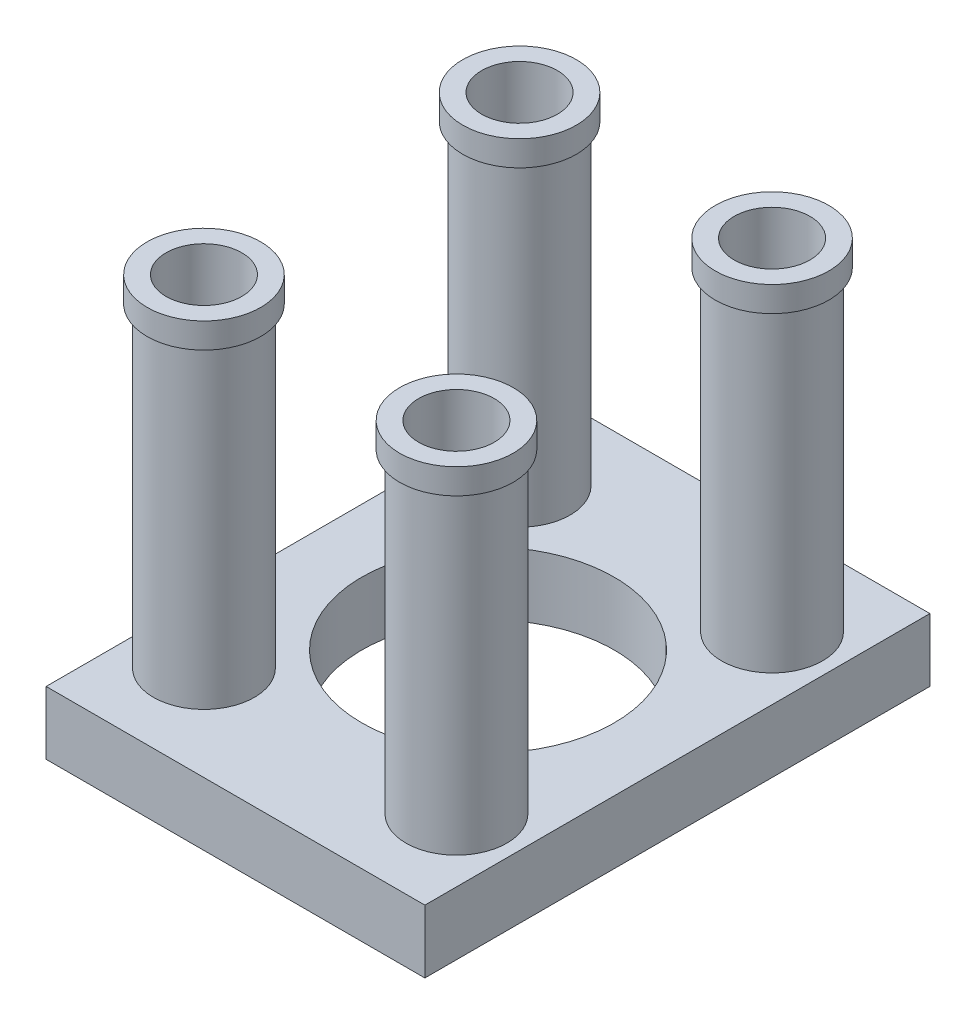
ISO-10303-21;
HEADER;
FILE_DESCRIPTION(('STEP AP214'),'2;1');
FILE_NAME('part.step','',(''),(''),'','','');
FILE_SCHEMA(('AUTOMOTIVE_DESIGN { 1 0 10303 214 1 1 1 1 }'));
ENDSEC;
DATA;
#1=APPLICATION_CONTEXT('core data for automotive mechanical design processes');
#2=APPLICATION_PROTOCOL_DEFINITION('international standard','automotive_design',2000,#1);
#3=PRODUCT_CONTEXT('',#1,'mechanical');
#4=PRODUCT('Part','Part','',(#3));
#5=PRODUCT_RELATED_PRODUCT_CATEGORY('part','',(#4));
#6=PRODUCT_DEFINITION_FORMATION('','',#4);
#7=PRODUCT_DEFINITION_CONTEXT('part definition',#1,'design');
#8=PRODUCT_DEFINITION('design','',#6,#7);
#9=PRODUCT_DEFINITION_SHAPE('','',#8);
#10=(LENGTH_UNIT() NAMED_UNIT(*) SI_UNIT(.MILLI.,.METRE.));
#11=(NAMED_UNIT(*) PLANE_ANGLE_UNIT() SI_UNIT($,.RADIAN.));
#12=(NAMED_UNIT(*) SI_UNIT($,.STERADIAN.) SOLID_ANGLE_UNIT());
#13=UNCERTAINTY_MEASURE_WITH_UNIT(LENGTH_MEASURE(1.E-05),#10,'distance_accuracy_value','');
#14=(GEOMETRIC_REPRESENTATION_CONTEXT(3) GLOBAL_UNCERTAINTY_ASSIGNED_CONTEXT((#13)) GLOBAL_UNIT_ASSIGNED_CONTEXT((#10,
#11,#12)) REPRESENTATION_CONTEXT('',''));
#15=CARTESIAN_POINT('',(0.,0.,0.));
#16=DIRECTION('',(0.,0.,1.));
#17=DIRECTION('',(1.,0.,0.));
#18=AXIS2_PLACEMENT_3D('',#15,#16,#17);
#19=CARTESIAN_POINT('',(-19.05,6.35,-25.4));
#20=DIRECTION('',(1.,0.,0.));
#21=DIRECTION('',(0.,0.,-1.));
#22=AXIS2_PLACEMENT_3D('',#19,#20,#21);
#23=PLANE('',#22);
#24=DIRECTION('',(0.,0.,1.));
#25=VECTOR('',#24,1.);
#26=CARTESIAN_POINT('',(-19.05,0.,-25.4));
#27=LINE('',#26,#25);
#28=CARTESIAN_POINT('',(-19.05,0.,-25.4));
#29=VERTEX_POINT('',#28);
#30=CARTESIAN_POINT('',(-19.05,0.,25.4));
#31=VERTEX_POINT('',#30);
#32=EDGE_CURVE('E98',#29,#31,#27,.T.);
#33=ORIENTED_EDGE('',*,*,#32,.T.);
#34=DIRECTION('',(0.,-1.,0.));
#35=VECTOR('',#34,1.);
#36=CARTESIAN_POINT('',(-19.05,6.35,25.4));
#37=LINE('',#36,#35);
#38=CARTESIAN_POINT('',(-19.05,6.35,25.4));
#39=VERTEX_POINT('',#38);
#40=EDGE_CURVE('E11',#39,#31,#37,.T.);
#41=ORIENTED_EDGE('',*,*,#40,.F.);
#42=DIRECTION('',(0.,0.,1.));
#43=VECTOR('',#42,1.);
#44=CARTESIAN_POINT('',(-19.05,6.35,-25.4));
#45=LINE('',#44,#43);
#46=CARTESIAN_POINT('',(-19.05,6.35,-25.4));
#47=VERTEX_POINT('',#46);
#48=EDGE_CURVE('E86',#47,#39,#45,.T.);
#49=ORIENTED_EDGE('',*,*,#48,.F.);
#50=DIRECTION('',(0.,-1.,0.));
#51=VECTOR('',#50,1.);
#52=CARTESIAN_POINT('',(-19.05,6.35,-25.4));
#53=LINE('',#52,#51);
#54=EDGE_CURVE('E94',#47,#29,#53,.T.);
#55=ORIENTED_EDGE('',*,*,#54,.T.);
#56=EDGE_LOOP('',(#33,#41,#49,#55));
#57=FACE_BOUND('',#56,.T.);
#58=ADVANCED_FACE('F35',(#57),#23,.F.);
#59=CARTESIAN_POINT('',(-19.05,6.35,25.4));
#60=DIRECTION('',(0.,0.,-1.));
#61=DIRECTION('',(-1.,0.,0.));
#62=AXIS2_PLACEMENT_3D('',#59,#60,#61);
#63=PLANE('',#62);
#64=DIRECTION('',(1.,0.,0.));
#65=VECTOR('',#64,1.);
#66=CARTESIAN_POINT('',(-19.05,0.,25.4));
#67=LINE('',#66,#65);
#68=CARTESIAN_POINT('',(19.05,0.,25.4));
#69=VERTEX_POINT('',#68);
#70=EDGE_CURVE('E90',#31,#69,#67,.T.);
#71=ORIENTED_EDGE('',*,*,#70,.T.);
#72=DIRECTION('',(0.,-1.,0.));
#73=VECTOR('',#72,1.);
#74=CARTESIAN_POINT('',(19.05,6.35,25.4));
#75=LINE('',#74,#73);
#76=CARTESIAN_POINT('',(19.05,6.35,25.4));
#77=VERTEX_POINT('',#76);
#78=EDGE_CURVE('E43',#77,#69,#75,.T.);
#79=ORIENTED_EDGE('',*,*,#78,.F.);
#80=DIRECTION('',(1.,0.,0.));
#81=VECTOR('',#80,1.);
#82=CARTESIAN_POINT('',(-19.05,6.35,25.4));
#83=LINE('',#82,#81);
#84=EDGE_CURVE('E81',#39,#77,#83,.T.);
#85=ORIENTED_EDGE('',*,*,#84,.F.);
#86=ORIENTED_EDGE('',*,*,#40,.T.);
#87=EDGE_LOOP('',(#71,#79,#85,#86));
#88=FACE_BOUND('',#87,.T.);
#89=ADVANCED_FACE('F89',(#88),#63,.F.);
#90=CARTESIAN_POINT('',(19.05,6.35,-25.4));
#91=DIRECTION('',(-1.,0.,0.));
#92=DIRECTION('',(0.,0.,1.));
#93=AXIS2_PLACEMENT_3D('',#90,#91,#92);
#94=PLANE('',#93);
#95=DIRECTION('',(0.,0.,-1.));
#96=VECTOR('',#95,1.);
#97=CARTESIAN_POINT('',(19.05,0.,-25.4));
#98=LINE('',#97,#96);
#99=CARTESIAN_POINT('',(19.05,0.,-25.4));
#100=VERTEX_POINT('',#99);
#101=EDGE_CURVE('E68',#69,#100,#98,.T.);
#102=ORIENTED_EDGE('',*,*,#101,.T.);
#103=DIRECTION('',(0.,-1.,0.));
#104=VECTOR('',#103,1.);
#105=CARTESIAN_POINT('',(19.05,6.35,-25.4));
#106=LINE('',#105,#104);
#107=CARTESIAN_POINT('',(19.05,6.35,-25.4));
#108=VERTEX_POINT('',#107);
#109=EDGE_CURVE('E91',#108,#100,#106,.T.);
#110=ORIENTED_EDGE('',*,*,#109,.F.);
#111=DIRECTION('',(0.,0.,-1.));
#112=VECTOR('',#111,1.);
#113=CARTESIAN_POINT('',(19.05,6.35,-25.4));
#114=LINE('',#113,#112);
#115=EDGE_CURVE('E84',#77,#108,#114,.T.);
#116=ORIENTED_EDGE('',*,*,#115,.F.);
#117=ORIENTED_EDGE('',*,*,#78,.T.);
#118=EDGE_LOOP('',(#102,#110,#116,#117));
#119=FACE_BOUND('',#118,.T.);
#120=ADVANCED_FACE('F92',(#119),#94,.F.);
#121=CARTESIAN_POINT('',(-19.05,6.35,-25.4));
#122=DIRECTION('',(0.,0.,1.));
#123=DIRECTION('',(1.,0.,0.));
#124=AXIS2_PLACEMENT_3D('',#121,#122,#123);
#125=PLANE('',#124);
#126=DIRECTION('',(-1.,0.,0.));
#127=VECTOR('',#126,1.);
#128=CARTESIAN_POINT('',(-19.05,0.,-25.4));
#129=LINE('',#128,#127);
#130=EDGE_CURVE('E74',#100,#29,#129,.T.);
#131=ORIENTED_EDGE('',*,*,#130,.T.);
#132=ORIENTED_EDGE('',*,*,#54,.F.);
#133=DIRECTION('',(-1.,0.,0.));
#134=VECTOR('',#133,1.);
#135=CARTESIAN_POINT('',(-19.05,6.35,-25.4));
#136=LINE('',#135,#134);
#137=EDGE_CURVE('E51',#108,#47,#136,.T.);
#138=ORIENTED_EDGE('',*,*,#137,.F.);
#139=ORIENTED_EDGE('',*,*,#109,.T.);
#140=EDGE_LOOP('',(#131,#132,#138,#139));
#141=FACE_BOUND('',#140,.T.);
#142=ADVANCED_FACE('F106',(#141),#125,.F.);
#143=CARTESIAN_POINT('',(0.,6.35,0.));
#144=DIRECTION('',(0.,1.,0.));
#145=DIRECTION('',(0.,0.,1.));
#146=AXIS2_PLACEMENT_3D('',#143,#144,#145);
#147=PLANE('',#146);
#148=CARTESIAN_POINT('',(0.,6.35,0.));
#149=DIRECTION('',(0.,1.,0.));
#150=DIRECTION('',(0.,0.,1.));
#151=AXIS2_PLACEMENT_3D('',#148,#149,#150);
#152=CIRCLE('',#151,12.7);
#153=CARTESIAN_POINT('',(0.,6.35,12.7));
#154=VERTEX_POINT('',#153);
#155=EDGE_CURVE('E136',#154,#154,#152,.T.);
#156=ORIENTED_EDGE('',*,*,#155,.F.);
#157=EDGE_LOOP('',(#156));
#158=FACE_BOUND('',#157,.T.);
#159=CARTESIAN_POINT('',(-12.7,6.35,15.875));
#160=DIRECTION('',(0.,1.,0.));
#161=DIRECTION('',(0.,0.,1.));
#162=AXIS2_PLACEMENT_3D('',#159,#160,#161);
#163=CIRCLE('',#162,5.08);
#164=CARTESIAN_POINT('',(-12.7,6.35,20.955));
#165=VERTEX_POINT('',#164);
#166=EDGE_CURVE('E130',#165,#165,#163,.T.);
#167=ORIENTED_EDGE('',*,*,#166,.F.);
#168=EDGE_LOOP('',(#167));
#169=FACE_BOUND('',#168,.T.);
#170=CARTESIAN_POINT('',(12.7,6.35,15.875));
#171=DIRECTION('',(0.,1.,0.));
#172=DIRECTION('',(0.,0.,1.));
#173=AXIS2_PLACEMENT_3D('',#170,#171,#172);
#174=CIRCLE('',#173,5.08);
#175=CARTESIAN_POINT('',(12.7,6.35,20.955));
#176=VERTEX_POINT('',#175);
#177=EDGE_CURVE('E124',#176,#176,#174,.T.);
#178=ORIENTED_EDGE('',*,*,#177,.F.);
#179=EDGE_LOOP('',(#178));
#180=FACE_BOUND('',#179,.T.);
#181=CARTESIAN_POINT('',(12.7,6.35,-15.875));
#182=DIRECTION('',(0.,1.,0.));
#183=DIRECTION('',(0.,0.,1.));
#184=AXIS2_PLACEMENT_3D('',#181,#182,#183);
#185=CIRCLE('',#184,5.08);
#186=CARTESIAN_POINT('',(12.7,6.35,-10.795));
#187=VERTEX_POINT('',#186);
#188=EDGE_CURVE('E118',#187,#187,#185,.T.);
#189=ORIENTED_EDGE('',*,*,#188,.F.);
#190=EDGE_LOOP('',(#189));
#191=FACE_BOUND('',#190,.T.);
#192=CARTESIAN_POINT('',(-12.7,6.35,-15.875));
#193=DIRECTION('',(0.,1.,0.));
#194=DIRECTION('',(0.,0.,1.));
#195=AXIS2_PLACEMENT_3D('',#192,#193,#194);
#196=CIRCLE('',#195,5.08);
#197=CARTESIAN_POINT('',(-12.7,6.35,-10.795));
#198=VERTEX_POINT('',#197);
#199=EDGE_CURVE('E112',#198,#198,#196,.T.);
#200=ORIENTED_EDGE('',*,*,#199,.F.);
#201=EDGE_LOOP('',(#200));
#202=FACE_BOUND('',#201,.T.);
#203=ORIENTED_EDGE('',*,*,#48,.T.);
#204=ORIENTED_EDGE('',*,*,#84,.T.);
#205=ORIENTED_EDGE('',*,*,#115,.T.);
#206=ORIENTED_EDGE('',*,*,#137,.T.);
#207=EDGE_LOOP('',(#203,#204,#205,#206));
#208=FACE_BOUND('',#207,.T.);
#209=ADVANCED_FACE('F82',(#158,#169,#180,#191,#202,#208),#147,.T.);
#210=CARTESIAN_POINT('',(0.,0.,0.));
#211=DIRECTION('',(0.,1.,0.));
#212=DIRECTION('',(0.,0.,1.));
#213=AXIS2_PLACEMENT_3D('',#210,#211,#212);
#214=PLANE('',#213);
#215=CARTESIAN_POINT('',(-12.7,0.,15.875));
#216=DIRECTION('',(0.,1.,0.));
#217=DIRECTION('',(0.,0.,1.));
#218=AXIS2_PLACEMENT_3D('',#215,#216,#217);
#219=CIRCLE('',#218,3.81);
#220=CARTESIAN_POINT('',(-12.7,0.,19.685));
#221=VERTEX_POINT('',#220);
#222=EDGE_CURVE('E150',#221,#221,#219,.T.);
#223=ORIENTED_EDGE('',*,*,#222,.T.);
#224=EDGE_LOOP('',(#223));
#225=FACE_BOUND('',#224,.T.);
#226=CARTESIAN_POINT('',(12.7,0.,15.875));
#227=DIRECTION('',(0.,1.,0.));
#228=DIRECTION('',(0.,0.,1.));
#229=AXIS2_PLACEMENT_3D('',#226,#227,#228);
#230=CIRCLE('',#229,3.81);
#231=CARTESIAN_POINT('',(12.7,0.,19.685));
#232=VERTEX_POINT('',#231);
#233=EDGE_CURVE('E147',#232,#232,#230,.T.);
#234=ORIENTED_EDGE('',*,*,#233,.T.);
#235=EDGE_LOOP('',(#234));
#236=FACE_BOUND('',#235,.T.);
#237=CARTESIAN_POINT('',(12.7,0.,-15.875));
#238=DIRECTION('',(0.,1.,0.));
#239=DIRECTION('',(0.,0.,1.));
#240=AXIS2_PLACEMENT_3D('',#237,#238,#239);
#241=CIRCLE('',#240,3.81);
#242=CARTESIAN_POINT('',(12.7,0.,-12.065));
#243=VERTEX_POINT('',#242);
#244=EDGE_CURVE('E144',#243,#243,#241,.T.);
#245=ORIENTED_EDGE('',*,*,#244,.T.);
#246=EDGE_LOOP('',(#245));
#247=FACE_BOUND('',#246,.T.);
#248=CARTESIAN_POINT('',(-12.7,0.,-15.875));
#249=DIRECTION('',(0.,1.,0.));
#250=DIRECTION('',(0.,0.,1.));
#251=AXIS2_PLACEMENT_3D('',#248,#249,#250);
#252=CIRCLE('',#251,3.81);
#253=CARTESIAN_POINT('',(-12.7,0.,-12.065));
#254=VERTEX_POINT('',#253);
#255=EDGE_CURVE('E139',#254,#254,#252,.T.);
#256=ORIENTED_EDGE('',*,*,#255,.T.);
#257=EDGE_LOOP('',(#256));
#258=FACE_BOUND('',#257,.T.);
#259=CARTESIAN_POINT('',(0.,0.,0.));
#260=DIRECTION('',(0.,1.,0.));
#261=DIRECTION('',(0.,0.,1.));
#262=AXIS2_PLACEMENT_3D('',#259,#260,#261);
#263=CIRCLE('',#262,12.7);
#264=CARTESIAN_POINT('',(0.,0.,12.7));
#265=VERTEX_POINT('',#264);
#266=EDGE_CURVE('E133',#265,#265,#263,.T.);
#267=ORIENTED_EDGE('',*,*,#266,.T.);
#268=EDGE_LOOP('',(#267));
#269=FACE_BOUND('',#268,.T.);
#270=ORIENTED_EDGE('',*,*,#32,.F.);
#271=ORIENTED_EDGE('',*,*,#130,.F.);
#272=ORIENTED_EDGE('',*,*,#101,.F.);
#273=ORIENTED_EDGE('',*,*,#70,.F.);
#274=EDGE_LOOP('',(#270,#271,#272,#273));
#275=FACE_BOUND('',#274,.T.);
#276=ADVANCED_FACE('F109',(#225,#236,#247,#258,#269,#275),#214,.F.);
#277=CARTESIAN_POINT('',(-12.7,38.1,-15.875));
#278=DIRECTION('',(0.,-1.,0.));
#279=DIRECTION('',(0.,0.,-1.));
#280=AXIS2_PLACEMENT_3D('',#277,#278,#279);
#281=CYLINDRICAL_SURFACE('',#280,5.08);
#282=CARTESIAN_POINT('',(-12.7,38.1,-15.875));
#283=DIRECTION('',(0.,1.,0.));
#284=DIRECTION('',(0.,0.,1.));
#285=AXIS2_PLACEMENT_3D('',#282,#283,#284);
#286=CIRCLE('',#285,5.08);
#287=CARTESIAN_POINT('',(-12.7,38.1,-10.795));
#288=VERTEX_POINT('',#287);
#289=EDGE_CURVE('E101',#288,#288,#286,.T.);
#290=ORIENTED_EDGE('',*,*,#289,.F.);
#291=EDGE_LOOP('',(#290));
#292=FACE_BOUND('',#291,.T.);
#293=ORIENTED_EDGE('',*,*,#199,.T.);
#294=EDGE_LOOP('',(#293));
#295=FACE_BOUND('',#294,.T.);
#296=ADVANCED_FACE('F220',(#292,#295),#281,.T.);
#297=CARTESIAN_POINT('',(12.7,38.1,-15.875));
#298=DIRECTION('',(0.,-1.,0.));
#299=DIRECTION('',(0.,0.,-1.));
#300=AXIS2_PLACEMENT_3D('',#297,#298,#299);
#301=CYLINDRICAL_SURFACE('',#300,5.08);
#302=CARTESIAN_POINT('',(12.7,38.1,-15.875));
#303=DIRECTION('',(0.,1.,0.));
#304=DIRECTION('',(0.,0.,1.));
#305=AXIS2_PLACEMENT_3D('',#302,#303,#304);
#306=CIRCLE('',#305,5.08);
#307=CARTESIAN_POINT('',(12.7,38.1,-10.795));
#308=VERTEX_POINT('',#307);
#309=EDGE_CURVE('E115',#308,#308,#306,.T.);
#310=ORIENTED_EDGE('',*,*,#309,.F.);
#311=EDGE_LOOP('',(#310));
#312=FACE_BOUND('',#311,.T.);
#313=ORIENTED_EDGE('',*,*,#188,.T.);
#314=EDGE_LOOP('',(#313));
#315=FACE_BOUND('',#314,.T.);
#316=ADVANCED_FACE('F227',(#312,#315),#301,.T.);
#317=CARTESIAN_POINT('',(12.7,38.1,15.875));
#318=DIRECTION('',(0.,-1.,0.));
#319=DIRECTION('',(0.,0.,-1.));
#320=AXIS2_PLACEMENT_3D('',#317,#318,#319);
#321=CYLINDRICAL_SURFACE('',#320,5.08);
#322=CARTESIAN_POINT('',(12.7,38.1,15.875));
#323=DIRECTION('',(0.,1.,0.));
#324=DIRECTION('',(0.,0.,1.));
#325=AXIS2_PLACEMENT_3D('',#322,#323,#324);
#326=CIRCLE('',#325,5.08);
#327=CARTESIAN_POINT('',(12.7,38.1,20.955));
#328=VERTEX_POINT('',#327);
#329=EDGE_CURVE('E121',#328,#328,#326,.T.);
#330=ORIENTED_EDGE('',*,*,#329,.F.);
#331=EDGE_LOOP('',(#330));
#332=FACE_BOUND('',#331,.T.);
#333=ORIENTED_EDGE('',*,*,#177,.T.);
#334=EDGE_LOOP('',(#333));
#335=FACE_BOUND('',#334,.T.);
#336=ADVANCED_FACE('F231',(#332,#335),#321,.T.);
#337=CARTESIAN_POINT('',(-12.7,38.1,15.875));
#338=DIRECTION('',(0.,-1.,0.));
#339=DIRECTION('',(0.,0.,-1.));
#340=AXIS2_PLACEMENT_3D('',#337,#338,#339);
#341=CYLINDRICAL_SURFACE('',#340,5.08);
#342=CARTESIAN_POINT('',(-12.7,38.1,15.875));
#343=DIRECTION('',(0.,1.,0.));
#344=DIRECTION('',(0.,0.,1.));
#345=AXIS2_PLACEMENT_3D('',#342,#343,#344);
#346=CIRCLE('',#345,5.08);
#347=CARTESIAN_POINT('',(-12.7,38.1,20.955));
#348=VERTEX_POINT('',#347);
#349=EDGE_CURVE('E127',#348,#348,#346,.T.);
#350=ORIENTED_EDGE('',*,*,#349,.F.);
#351=EDGE_LOOP('',(#350));
#352=FACE_BOUND('',#351,.T.);
#353=ORIENTED_EDGE('',*,*,#166,.T.);
#354=EDGE_LOOP('',(#353));
#355=FACE_BOUND('',#354,.T.);
#356=ADVANCED_FACE('F235',(#352,#355),#341,.T.);
#357=CARTESIAN_POINT('',(0.,0.,0.));
#358=DIRECTION('',(0.,1.,0.));
#359=DIRECTION('',(0.,0.,1.));
#360=AXIS2_PLACEMENT_3D('',#357,#358,#359);
#361=CYLINDRICAL_SURFACE('',#360,12.7);
#362=ORIENTED_EDGE('',*,*,#266,.F.);
#363=EDGE_LOOP('',(#362));
#364=FACE_BOUND('',#363,.T.);
#365=ORIENTED_EDGE('',*,*,#155,.T.);
#366=EDGE_LOOP('',(#365));
#367=FACE_BOUND('',#366,.T.);
#368=ADVANCED_FACE('F239',(#364,#367),#361,.F.);
#369=CARTESIAN_POINT('',(-12.7,0.,-15.875));
#370=DIRECTION('',(0.,1.,0.));
#371=DIRECTION('',(0.,0.,1.));
#372=AXIS2_PLACEMENT_3D('',#369,#370,#371);
#373=CYLINDRICAL_SURFACE('',#372,3.81);
#374=CARTESIAN_POINT('',(-12.7,40.64,-15.875));
#375=DIRECTION('',(0.,1.,0.));
#376=DIRECTION('',(0.,0.,1.));
#377=AXIS2_PLACEMENT_3D('',#374,#375,#376);
#378=CIRCLE('',#377,3.81);
#379=CARTESIAN_POINT('',(-12.7,40.64,-12.065));
#380=VERTEX_POINT('',#379);
#381=EDGE_CURVE('E157',#380,#380,#378,.T.);
#382=CARTESIAN_POINT('',(-12.7,0.,-12.065));
#383=CARTESIAN_POINT('',(-12.7,0.423333333333333,-12.065));
#384=CARTESIAN_POINT('',(-12.7,0.846666666666667,-12.065));
#385=CARTESIAN_POINT('',(-12.7,1.69333333333333,-12.065));
#386=CARTESIAN_POINT('',(-12.7,2.11666666666667,-12.065));
#387=CARTESIAN_POINT('',(-12.7,2.96333333333333,-12.065));
#388=CARTESIAN_POINT('',(-12.7,3.38666666666667,-12.065));
#389=CARTESIAN_POINT('',(-12.7,4.23333333333333,-12.065));
#390=CARTESIAN_POINT('',(-12.7,4.65666666666667,-12.065));
#391=CARTESIAN_POINT('',(-12.7,5.50333333333333,-12.065));
#392=CARTESIAN_POINT('',(-12.7,5.92666666666667,-12.065));
#393=CARTESIAN_POINT('',(-12.7,6.77333333333333,-12.065));
#394=CARTESIAN_POINT('',(-12.7,7.19666666666667,-12.065));
#395=CARTESIAN_POINT('',(-12.7,8.04333333333333,-12.065));
#396=CARTESIAN_POINT('',(-12.7,8.46666666666667,-12.065));
#397=CARTESIAN_POINT('',(-12.7,9.31333333333333,-12.065));
#398=CARTESIAN_POINT('',(-12.7,9.73666666666667,-12.065));
#399=CARTESIAN_POINT('',(-12.7,10.5833333333333,-12.065));
#400=CARTESIAN_POINT('',(-12.7,11.0066666666667,-12.065));
#401=CARTESIAN_POINT('',(-12.7,11.8533333333333,-12.065));
#402=CARTESIAN_POINT('',(-12.7,12.2766666666667,-12.065));
#403=CARTESIAN_POINT('',(-12.7,13.1233333333333,-12.065));
#404=CARTESIAN_POINT('',(-12.7,13.5466666666667,-12.065));
#405=CARTESIAN_POINT('',(-12.7,14.3933333333333,-12.065));
#406=CARTESIAN_POINT('',(-12.7,14.8166666666667,-12.065));
#407=CARTESIAN_POINT('',(-12.7,15.6633333333333,-12.065));
#408=CARTESIAN_POINT('',(-12.7,16.0866666666667,-12.065));
#409=CARTESIAN_POINT('',(-12.7,16.9333333333333,-12.065));
#410=CARTESIAN_POINT('',(-12.7,17.3566666666667,-12.065));
#411=CARTESIAN_POINT('',(-12.7,18.2033333333333,-12.065));
#412=CARTESIAN_POINT('',(-12.7,18.6266666666667,-12.065));
#413=CARTESIAN_POINT('',(-12.7,19.4733333333333,-12.065));
#414=CARTESIAN_POINT('',(-12.7,19.8966666666667,-12.065));
#415=CARTESIAN_POINT('',(-12.7,20.7433333333333,-12.065));
#416=CARTESIAN_POINT('',(-12.7,21.1666666666667,-12.065));
#417=CARTESIAN_POINT('',(-12.7,22.0133333333333,-12.065));
#418=CARTESIAN_POINT('',(-12.7,22.4366666666667,-12.065));
#419=CARTESIAN_POINT('',(-12.7,23.2833333333333,-12.065));
#420=CARTESIAN_POINT('',(-12.7,23.7066666666667,-12.065));
#421=CARTESIAN_POINT('',(-12.7,24.5533333333333,-12.065));
#422=CARTESIAN_POINT('',(-12.7,24.9766666666667,-12.065));
#423=CARTESIAN_POINT('',(-12.7,25.8233333333333,-12.065));
#424=CARTESIAN_POINT('',(-12.7,26.2466666666667,-12.065));
#425=CARTESIAN_POINT('',(-12.7,27.0933333333333,-12.065));
#426=CARTESIAN_POINT('',(-12.7,27.5166666666667,-12.065));
#427=CARTESIAN_POINT('',(-12.7,28.3633333333333,-12.065));
#428=CARTESIAN_POINT('',(-12.7,28.7866666666667,-12.065));
#429=CARTESIAN_POINT('',(-12.7,29.6333333333333,-12.065));
#430=CARTESIAN_POINT('',(-12.7,30.0566666666667,-12.065));
#431=CARTESIAN_POINT('',(-12.7,30.9033333333333,-12.065));
#432=CARTESIAN_POINT('',(-12.7,31.3266666666667,-12.065));
#433=CARTESIAN_POINT('',(-12.7,32.1733333333333,-12.065));
#434=CARTESIAN_POINT('',(-12.7,32.5966666666667,-12.065));
#435=CARTESIAN_POINT('',(-12.7,33.4433333333333,-12.065));
#436=CARTESIAN_POINT('',(-12.7,33.8666666666667,-12.065));
#437=CARTESIAN_POINT('',(-12.7,34.7133333333333,-12.065));
#438=CARTESIAN_POINT('',(-12.7,35.1366666666667,-12.065));
#439=CARTESIAN_POINT('',(-12.7,35.9833333333333,-12.065));
#440=CARTESIAN_POINT('',(-12.7,36.4066666666667,-12.065));
#441=CARTESIAN_POINT('',(-12.7,37.2533333333333,-12.065));
#442=CARTESIAN_POINT('',(-12.7,37.6766666666667,-12.065));
#443=CARTESIAN_POINT('',(-12.7,38.5233333333333,-12.065));
#444=CARTESIAN_POINT('',(-12.7,38.9466666666667,-12.065));
#445=CARTESIAN_POINT('',(-12.7,39.7933333333333,-12.065));
#446=CARTESIAN_POINT('',(-12.7,40.2166666666667,-12.065));
#447=CARTESIAN_POINT('',(-12.7,40.64,-12.065));
#448=B_SPLINE_CURVE_WITH_KNOTS('',3,(#382,#383,#384,#385,#386,#387,#388,#389,#390,#391,#392,
#393,#394,#395,#396,#397,#398,#399,#400,#401,#402,#403,#404,#405,#406,#407,#408,#409,#410,#411,
#412,#413,#414,#415,#416,#417,#418,#419,#420,#421,#422,#423,#424,#425,#426,#427,#428,#429,#430,
#431,#432,#433,#434,#435,#436,#437,#438,#439,#440,#441,#442,#443,#444,#445,#446,#447),
.UNSPECIFIED.,.F.,.F.,(4,2,2,2,2,2,2,2,2,2,2,2,2,2,2,2,2,2,2,2,2,2,2,2,2,2,2,2,2,2,2,2,4),(0.,
1.27,2.54,3.81,5.08,6.35,7.62,8.89,10.16,11.43,12.7,13.97,15.24,16.51,17.78,19.05,20.32,21.59,
22.86,24.13,25.4,26.67,27.94,29.21,30.48,31.75,33.02,34.29,35.56,36.83,38.1,39.37,40.64),.UNSPECIFIED.);
#449=EDGE_CURVE('BSEAM243',#254,#380,#448,.T.);
#450=ORIENTED_EDGE('',*,*,#255,.F.);
#451=ORIENTED_EDGE('',*,*,#381,.T.);
#452=ORIENTED_EDGE('',*,*,#449,.T.);
#453=ORIENTED_EDGE('',*,*,#449,.F.);
#454=EDGE_LOOP('',(#450,#452,#451,#453));
#455=FACE_BOUND('',#454,.T.);
#456=ADVANCED_FACE('F243',(#455),#373,.F.);
#457=CARTESIAN_POINT('',(12.7,0.,-15.875));
#458=DIRECTION('',(0.,1.,0.));
#459=DIRECTION('',(0.,0.,1.));
#460=AXIS2_PLACEMENT_3D('',#457,#458,#459);
#461=CYLINDRICAL_SURFACE('',#460,3.81);
#462=CARTESIAN_POINT('',(12.7,40.64,-15.875));
#463=DIRECTION('',(0.,1.,0.));
#464=DIRECTION('',(0.,0.,1.));
#465=AXIS2_PLACEMENT_3D('',#462,#463,#464);
#466=CIRCLE('',#465,3.81);
#467=CARTESIAN_POINT('',(12.7,40.64,-12.065));
#468=VERTEX_POINT('',#467);
#469=EDGE_CURVE('E184',#468,#468,#466,.T.);
#470=CARTESIAN_POINT('',(12.7,0.,-12.065));
#471=CARTESIAN_POINT('',(12.7,0.423333333333333,-12.065));
#472=CARTESIAN_POINT('',(12.7,0.846666666666667,-12.065));
#473=CARTESIAN_POINT('',(12.7,1.69333333333333,-12.065));
#474=CARTESIAN_POINT('',(12.7,2.11666666666667,-12.065));
#475=CARTESIAN_POINT('',(12.7,2.96333333333333,-12.065));
#476=CARTESIAN_POINT('',(12.7,3.38666666666667,-12.065));
#477=CARTESIAN_POINT('',(12.7,4.23333333333333,-12.065));
#478=CARTESIAN_POINT('',(12.7,4.65666666666667,-12.065));
#479=CARTESIAN_POINT('',(12.7,5.50333333333333,-12.065));
#480=CARTESIAN_POINT('',(12.7,5.92666666666667,-12.065));
#481=CARTESIAN_POINT('',(12.7,6.77333333333333,-12.065));
#482=CARTESIAN_POINT('',(12.7,7.19666666666667,-12.065));
#483=CARTESIAN_POINT('',(12.7,8.04333333333333,-12.065));
#484=CARTESIAN_POINT('',(12.7,8.46666666666667,-12.065));
#485=CARTESIAN_POINT('',(12.7,9.31333333333333,-12.065));
#486=CARTESIAN_POINT('',(12.7,9.73666666666667,-12.065));
#487=CARTESIAN_POINT('',(12.7,10.5833333333333,-12.065));
#488=CARTESIAN_POINT('',(12.7,11.0066666666667,-12.065));
#489=CARTESIAN_POINT('',(12.7,11.8533333333333,-12.065));
#490=CARTESIAN_POINT('',(12.7,12.2766666666667,-12.065));
#491=CARTESIAN_POINT('',(12.7,13.1233333333333,-12.065));
#492=CARTESIAN_POINT('',(12.7,13.5466666666667,-12.065));
#493=CARTESIAN_POINT('',(12.7,14.3933333333333,-12.065));
#494=CARTESIAN_POINT('',(12.7,14.8166666666667,-12.065));
#495=CARTESIAN_POINT('',(12.7,15.6633333333333,-12.065));
#496=CARTESIAN_POINT('',(12.7,16.0866666666667,-12.065));
#497=CARTESIAN_POINT('',(12.7,16.9333333333333,-12.065));
#498=CARTESIAN_POINT('',(12.7,17.3566666666667,-12.065));
#499=CARTESIAN_POINT('',(12.7,18.2033333333333,-12.065));
#500=CARTESIAN_POINT('',(12.7,18.6266666666667,-12.065));
#501=CARTESIAN_POINT('',(12.7,19.4733333333333,-12.065));
#502=CARTESIAN_POINT('',(12.7,19.8966666666667,-12.065));
#503=CARTESIAN_POINT('',(12.7,20.7433333333333,-12.065));
#504=CARTESIAN_POINT('',(12.7,21.1666666666667,-12.065));
#505=CARTESIAN_POINT('',(12.7,22.0133333333333,-12.065));
#506=CARTESIAN_POINT('',(12.7,22.4366666666667,-12.065));
#507=CARTESIAN_POINT('',(12.7,23.2833333333333,-12.065));
#508=CARTESIAN_POINT('',(12.7,23.7066666666667,-12.065));
#509=CARTESIAN_POINT('',(12.7,24.5533333333333,-12.065));
#510=CARTESIAN_POINT('',(12.7,24.9766666666667,-12.065));
#511=CARTESIAN_POINT('',(12.7,25.8233333333333,-12.065));
#512=CARTESIAN_POINT('',(12.7,26.2466666666667,-12.065));
#513=CARTESIAN_POINT('',(12.7,27.0933333333333,-12.065));
#514=CARTESIAN_POINT('',(12.7,27.5166666666667,-12.065));
#515=CARTESIAN_POINT('',(12.7,28.3633333333333,-12.065));
#516=CARTESIAN_POINT('',(12.7,28.7866666666667,-12.065));
#517=CARTESIAN_POINT('',(12.7,29.6333333333333,-12.065));
#518=CARTESIAN_POINT('',(12.7,30.0566666666667,-12.065));
#519=CARTESIAN_POINT('',(12.7,30.9033333333333,-12.065));
#520=CARTESIAN_POINT('',(12.7,31.3266666666667,-12.065));
#521=CARTESIAN_POINT('',(12.7,32.1733333333333,-12.065));
#522=CARTESIAN_POINT('',(12.7,32.5966666666667,-12.065));
#523=CARTESIAN_POINT('',(12.7,33.4433333333333,-12.065));
#524=CARTESIAN_POINT('',(12.7,33.8666666666667,-12.065));
#525=CARTESIAN_POINT('',(12.7,34.7133333333333,-12.065));
#526=CARTESIAN_POINT('',(12.7,35.1366666666667,-12.065));
#527=CARTESIAN_POINT('',(12.7,35.9833333333333,-12.065));
#528=CARTESIAN_POINT('',(12.7,36.4066666666667,-12.065));
#529=CARTESIAN_POINT('',(12.7,37.2533333333333,-12.065));
#530=CARTESIAN_POINT('',(12.7,37.6766666666667,-12.065));
#531=CARTESIAN_POINT('',(12.7,38.5233333333333,-12.065));
#532=CARTESIAN_POINT('',(12.7,38.9466666666667,-12.065));
#533=CARTESIAN_POINT('',(12.7,39.7933333333333,-12.065));
#534=CARTESIAN_POINT('',(12.7,40.2166666666667,-12.065));
#535=CARTESIAN_POINT('',(12.7,40.64,-12.065));
#536=B_SPLINE_CURVE_WITH_KNOTS('',3,(#470,#471,#472,#473,#474,#475,#476,#477,#478,#479,#480,
#481,#482,#483,#484,#485,#486,#487,#488,#489,#490,#491,#492,#493,#494,#495,#496,#497,#498,#499,
#500,#501,#502,#503,#504,#505,#506,#507,#508,#509,#510,#511,#512,#513,#514,#515,#516,#517,#518,
#519,#520,#521,#522,#523,#524,#525,#526,#527,#528,#529,#530,#531,#532,#533,#534,#535),
.UNSPECIFIED.,.F.,.F.,(4,2,2,2,2,2,2,2,2,2,2,2,2,2,2,2,2,2,2,2,2,2,2,2,2,2,2,2,2,2,2,2,4),(0.,
1.27,2.54,3.81,5.08,6.35,7.62,8.89,10.16,11.43,12.7,13.97,15.24,16.51,17.78,19.05,20.32,21.59,
22.86,24.13,25.4,26.67,27.94,29.21,30.48,31.75,33.02,34.29,35.56,36.83,38.1,39.37,40.64),.UNSPECIFIED.);
#537=EDGE_CURVE('BSEAM190',#243,#468,#536,.T.);
#538=ORIENTED_EDGE('',*,*,#244,.F.);
#539=ORIENTED_EDGE('',*,*,#469,.T.);
#540=ORIENTED_EDGE('',*,*,#537,.T.);
#541=ORIENTED_EDGE('',*,*,#537,.F.);
#542=EDGE_LOOP('',(#538,#540,#539,#541));
#543=FACE_BOUND('',#542,.T.);
#544=ADVANCED_FACE('F190',(#543),#461,.F.);
#545=CARTESIAN_POINT('',(12.7,0.,15.875));
#546=DIRECTION('',(0.,1.,0.));
#547=DIRECTION('',(0.,0.,1.));
#548=AXIS2_PLACEMENT_3D('',#545,#546,#547);
#549=CYLINDRICAL_SURFACE('',#548,3.81);
#550=CARTESIAN_POINT('',(12.7,40.64,15.875));
#551=DIRECTION('',(0.,1.,0.));
#552=DIRECTION('',(0.,0.,1.));
#553=AXIS2_PLACEMENT_3D('',#550,#551,#552);
#554=CIRCLE('',#553,3.81);
#555=CARTESIAN_POINT('',(12.7,40.64,19.685));
#556=VERTEX_POINT('',#555);
#557=EDGE_CURVE('E175',#556,#556,#554,.T.);
#558=CARTESIAN_POINT('',(12.7,0.,19.685));
#559=CARTESIAN_POINT('',(12.7,0.423333333333333,19.685));
#560=CARTESIAN_POINT('',(12.7,0.846666666666667,19.685));
#561=CARTESIAN_POINT('',(12.7,1.69333333333333,19.685));
#562=CARTESIAN_POINT('',(12.7,2.11666666666667,19.685));
#563=CARTESIAN_POINT('',(12.7,2.96333333333333,19.685));
#564=CARTESIAN_POINT('',(12.7,3.38666666666667,19.685));
#565=CARTESIAN_POINT('',(12.7,4.23333333333333,19.685));
#566=CARTESIAN_POINT('',(12.7,4.65666666666667,19.685));
#567=CARTESIAN_POINT('',(12.7,5.50333333333333,19.685));
#568=CARTESIAN_POINT('',(12.7,5.92666666666667,19.685));
#569=CARTESIAN_POINT('',(12.7,6.77333333333333,19.685));
#570=CARTESIAN_POINT('',(12.7,7.19666666666667,19.685));
#571=CARTESIAN_POINT('',(12.7,8.04333333333333,19.685));
#572=CARTESIAN_POINT('',(12.7,8.46666666666667,19.685));
#573=CARTESIAN_POINT('',(12.7,9.31333333333333,19.685));
#574=CARTESIAN_POINT('',(12.7,9.73666666666667,19.685));
#575=CARTESIAN_POINT('',(12.7,10.5833333333333,19.685));
#576=CARTESIAN_POINT('',(12.7,11.0066666666667,19.685));
#577=CARTESIAN_POINT('',(12.7,11.8533333333333,19.685));
#578=CARTESIAN_POINT('',(12.7,12.2766666666667,19.685));
#579=CARTESIAN_POINT('',(12.7,13.1233333333333,19.685));
#580=CARTESIAN_POINT('',(12.7,13.5466666666667,19.685));
#581=CARTESIAN_POINT('',(12.7,14.3933333333333,19.685));
#582=CARTESIAN_POINT('',(12.7,14.8166666666667,19.685));
#583=CARTESIAN_POINT('',(12.7,15.6633333333333,19.685));
#584=CARTESIAN_POINT('',(12.7,16.0866666666667,19.685));
#585=CARTESIAN_POINT('',(12.7,16.9333333333333,19.685));
#586=CARTESIAN_POINT('',(12.7,17.3566666666667,19.685));
#587=CARTESIAN_POINT('',(12.7,18.2033333333333,19.685));
#588=CARTESIAN_POINT('',(12.7,18.6266666666667,19.685));
#589=CARTESIAN_POINT('',(12.7,19.4733333333333,19.685));
#590=CARTESIAN_POINT('',(12.7,19.8966666666667,19.685));
#591=CARTESIAN_POINT('',(12.7,20.7433333333333,19.685));
#592=CARTESIAN_POINT('',(12.7,21.1666666666667,19.685));
#593=CARTESIAN_POINT('',(12.7,22.0133333333333,19.685));
#594=CARTESIAN_POINT('',(12.7,22.4366666666667,19.685));
#595=CARTESIAN_POINT('',(12.7,23.2833333333333,19.685));
#596=CARTESIAN_POINT('',(12.7,23.7066666666667,19.685));
#597=CARTESIAN_POINT('',(12.7,24.5533333333333,19.685));
#598=CARTESIAN_POINT('',(12.7,24.9766666666667,19.685));
#599=CARTESIAN_POINT('',(12.7,25.8233333333333,19.685));
#600=CARTESIAN_POINT('',(12.7,26.2466666666667,19.685));
#601=CARTESIAN_POINT('',(12.7,27.0933333333333,19.685));
#602=CARTESIAN_POINT('',(12.7,27.5166666666667,19.685));
#603=CARTESIAN_POINT('',(12.7,28.3633333333333,19.685));
#604=CARTESIAN_POINT('',(12.7,28.7866666666667,19.685));
#605=CARTESIAN_POINT('',(12.7,29.6333333333333,19.685));
#606=CARTESIAN_POINT('',(12.7,30.0566666666667,19.685));
#607=CARTESIAN_POINT('',(12.7,30.9033333333333,19.685));
#608=CARTESIAN_POINT('',(12.7,31.3266666666667,19.685));
#609=CARTESIAN_POINT('',(12.7,32.1733333333333,19.685));
#610=CARTESIAN_POINT('',(12.7,32.5966666666667,19.685));
#611=CARTESIAN_POINT('',(12.7,33.4433333333333,19.685));
#612=CARTESIAN_POINT('',(12.7,33.8666666666667,19.685));
#613=CARTESIAN_POINT('',(12.7,34.7133333333333,19.685));
#614=CARTESIAN_POINT('',(12.7,35.1366666666667,19.685));
#615=CARTESIAN_POINT('',(12.7,35.9833333333333,19.685));
#616=CARTESIAN_POINT('',(12.7,36.4066666666667,19.685));
#617=CARTESIAN_POINT('',(12.7,37.2533333333333,19.685));
#618=CARTESIAN_POINT('',(12.7,37.6766666666667,19.685));
#619=CARTESIAN_POINT('',(12.7,38.5233333333333,19.685));
#620=CARTESIAN_POINT('',(12.7,38.9466666666667,19.685));
#621=CARTESIAN_POINT('',(12.7,39.7933333333333,19.685));
#622=CARTESIAN_POINT('',(12.7,40.2166666666667,19.685));
#623=CARTESIAN_POINT('',(12.7,40.64,19.685));
#624=B_SPLINE_CURVE_WITH_KNOTS('',3,(#558,#559,#560,#561,#562,#563,#564,#565,#566,#567,#568,
#569,#570,#571,#572,#573,#574,#575,#576,#577,#578,#579,#580,#581,#582,#583,#584,#585,#586,#587,
#588,#589,#590,#591,#592,#593,#594,#595,#596,#597,#598,#599,#600,#601,#602,#603,#604,#605,#606,
#607,#608,#609,#610,#611,#612,#613,#614,#615,#616,#617,#618,#619,#620,#621,#622,#623),
.UNSPECIFIED.,.F.,.F.,(4,2,2,2,2,2,2,2,2,2,2,2,2,2,2,2,2,2,2,2,2,2,2,2,2,2,2,2,2,2,2,2,4),(0.,
1.27,2.54,3.81,5.08,6.35,7.62,8.89,10.16,11.43,12.7,13.97,15.24,16.51,17.78,19.05,20.32,21.59,
22.86,24.13,25.4,26.67,27.94,29.21,30.48,31.75,33.02,34.29,35.56,36.83,38.1,39.37,40.64),.UNSPECIFIED.);
#625=EDGE_CURVE('BSEAM250',#232,#556,#624,.T.);
#626=ORIENTED_EDGE('',*,*,#233,.F.);
#627=ORIENTED_EDGE('',*,*,#557,.T.);
#628=ORIENTED_EDGE('',*,*,#625,.T.);
#629=ORIENTED_EDGE('',*,*,#625,.F.);
#630=EDGE_LOOP('',(#626,#628,#627,#629));
#631=FACE_BOUND('',#630,.T.);
#632=ADVANCED_FACE('F250',(#631),#549,.F.);
#633=CARTESIAN_POINT('',(-12.7,0.,15.875));
#634=DIRECTION('',(0.,1.,0.));
#635=DIRECTION('',(0.,0.,1.));
#636=AXIS2_PLACEMENT_3D('',#633,#634,#635);
#637=CYLINDRICAL_SURFACE('',#636,3.81);
#638=CARTESIAN_POINT('',(-12.7,40.64,15.875));
#639=DIRECTION('',(0.,1.,0.));
#640=DIRECTION('',(0.,0.,1.));
#641=AXIS2_PLACEMENT_3D('',#638,#639,#640);
#642=CIRCLE('',#641,3.81);
#643=CARTESIAN_POINT('',(-12.7,40.64,19.685));
#644=VERTEX_POINT('',#643);
#645=EDGE_CURVE('E166',#644,#644,#642,.T.);
#646=CARTESIAN_POINT('',(-12.7,0.,19.685));
#647=CARTESIAN_POINT('',(-12.7,0.423333333333333,19.685));
#648=CARTESIAN_POINT('',(-12.7,0.846666666666667,19.685));
#649=CARTESIAN_POINT('',(-12.7,1.69333333333333,19.685));
#650=CARTESIAN_POINT('',(-12.7,2.11666666666667,19.685));
#651=CARTESIAN_POINT('',(-12.7,2.96333333333333,19.685));
#652=CARTESIAN_POINT('',(-12.7,3.38666666666667,19.685));
#653=CARTESIAN_POINT('',(-12.7,4.23333333333333,19.685));
#654=CARTESIAN_POINT('',(-12.7,4.65666666666667,19.685));
#655=CARTESIAN_POINT('',(-12.7,5.50333333333333,19.685));
#656=CARTESIAN_POINT('',(-12.7,5.92666666666667,19.685));
#657=CARTESIAN_POINT('',(-12.7,6.77333333333333,19.685));
#658=CARTESIAN_POINT('',(-12.7,7.19666666666667,19.685));
#659=CARTESIAN_POINT('',(-12.7,8.04333333333333,19.685));
#660=CARTESIAN_POINT('',(-12.7,8.46666666666667,19.685));
#661=CARTESIAN_POINT('',(-12.7,9.31333333333333,19.685));
#662=CARTESIAN_POINT('',(-12.7,9.73666666666667,19.685));
#663=CARTESIAN_POINT('',(-12.7,10.5833333333333,19.685));
#664=CARTESIAN_POINT('',(-12.7,11.0066666666667,19.685));
#665=CARTESIAN_POINT('',(-12.7,11.8533333333333,19.685));
#666=CARTESIAN_POINT('',(-12.7,12.2766666666667,19.685));
#667=CARTESIAN_POINT('',(-12.7,13.1233333333333,19.685));
#668=CARTESIAN_POINT('',(-12.7,13.5466666666667,19.685));
#669=CARTESIAN_POINT('',(-12.7,14.3933333333333,19.685));
#670=CARTESIAN_POINT('',(-12.7,14.8166666666667,19.685));
#671=CARTESIAN_POINT('',(-12.7,15.6633333333333,19.685));
#672=CARTESIAN_POINT('',(-12.7,16.0866666666667,19.685));
#673=CARTESIAN_POINT('',(-12.7,16.9333333333333,19.685));
#674=CARTESIAN_POINT('',(-12.7,17.3566666666667,19.685));
#675=CARTESIAN_POINT('',(-12.7,18.2033333333333,19.685));
#676=CARTESIAN_POINT('',(-12.7,18.6266666666667,19.685));
#677=CARTESIAN_POINT('',(-12.7,19.4733333333333,19.685));
#678=CARTESIAN_POINT('',(-12.7,19.8966666666667,19.685));
#679=CARTESIAN_POINT('',(-12.7,20.7433333333333,19.685));
#680=CARTESIAN_POINT('',(-12.7,21.1666666666667,19.685));
#681=CARTESIAN_POINT('',(-12.7,22.0133333333333,19.685));
#682=CARTESIAN_POINT('',(-12.7,22.4366666666667,19.685));
#683=CARTESIAN_POINT('',(-12.7,23.2833333333333,19.685));
#684=CARTESIAN_POINT('',(-12.7,23.7066666666667,19.685));
#685=CARTESIAN_POINT('',(-12.7,24.5533333333333,19.685));
#686=CARTESIAN_POINT('',(-12.7,24.9766666666667,19.685));
#687=CARTESIAN_POINT('',(-12.7,25.8233333333333,19.685));
#688=CARTESIAN_POINT('',(-12.7,26.2466666666667,19.685));
#689=CARTESIAN_POINT('',(-12.7,27.0933333333333,19.685));
#690=CARTESIAN_POINT('',(-12.7,27.5166666666667,19.685));
#691=CARTESIAN_POINT('',(-12.7,28.3633333333333,19.685));
#692=CARTESIAN_POINT('',(-12.7,28.7866666666667,19.685));
#693=CARTESIAN_POINT('',(-12.7,29.6333333333333,19.685));
#694=CARTESIAN_POINT('',(-12.7,30.0566666666667,19.685));
#695=CARTESIAN_POINT('',(-12.7,30.9033333333333,19.685));
#696=CARTESIAN_POINT('',(-12.7,31.3266666666667,19.685));
#697=CARTESIAN_POINT('',(-12.7,32.1733333333333,19.685));
#698=CARTESIAN_POINT('',(-12.7,32.5966666666667,19.685));
#699=CARTESIAN_POINT('',(-12.7,33.4433333333333,19.685));
#700=CARTESIAN_POINT('',(-12.7,33.8666666666667,19.685));
#701=CARTESIAN_POINT('',(-12.7,34.7133333333333,19.685));
#702=CARTESIAN_POINT('',(-12.7,35.1366666666667,19.685));
#703=CARTESIAN_POINT('',(-12.7,35.9833333333333,19.685));
#704=CARTESIAN_POINT('',(-12.7,36.4066666666667,19.685));
#705=CARTESIAN_POINT('',(-12.7,37.2533333333333,19.685));
#706=CARTESIAN_POINT('',(-12.7,37.6766666666667,19.685));
#707=CARTESIAN_POINT('',(-12.7,38.5233333333333,19.685));
#708=CARTESIAN_POINT('',(-12.7,38.9466666666667,19.685));
#709=CARTESIAN_POINT('',(-12.7,39.7933333333333,19.685));
#710=CARTESIAN_POINT('',(-12.7,40.2166666666667,19.685));
#711=CARTESIAN_POINT('',(-12.7,40.64,19.685));
#712=B_SPLINE_CURVE_WITH_KNOTS('',3,(#646,#647,#648,#649,#650,#651,#652,#653,#654,#655,#656,
#657,#658,#659,#660,#661,#662,#663,#664,#665,#666,#667,#668,#669,#670,#671,#672,#673,#674,#675,
#676,#677,#678,#679,#680,#681,#682,#683,#684,#685,#686,#687,#688,#689,#690,#691,#692,#693,#694,
#695,#696,#697,#698,#699,#700,#701,#702,#703,#704,#705,#706,#707,#708,#709,#710,#711),
.UNSPECIFIED.,.F.,.F.,(4,2,2,2,2,2,2,2,2,2,2,2,2,2,2,2,2,2,2,2,2,2,2,2,2,2,2,2,2,2,2,2,4),(0.,
1.27,2.54,3.81,5.08,6.35,7.62,8.89,10.16,11.43,12.7,13.97,15.24,16.51,17.78,19.05,20.32,21.59,
22.86,24.13,25.4,26.67,27.94,29.21,30.48,31.75,33.02,34.29,35.56,36.83,38.1,39.37,40.64),.UNSPECIFIED.);
#713=EDGE_CURVE('BSEAM254',#221,#644,#712,.T.);
#714=ORIENTED_EDGE('',*,*,#222,.F.);
#715=ORIENTED_EDGE('',*,*,#645,.T.);
#716=ORIENTED_EDGE('',*,*,#713,.T.);
#717=ORIENTED_EDGE('',*,*,#713,.F.);
#718=EDGE_LOOP('',(#714,#716,#715,#717));
#719=FACE_BOUND('',#718,.T.);
#720=ADVANCED_FACE('F254',(#719),#637,.F.);
#721=CARTESIAN_POINT('',(-12.7,38.1,-15.875));
#722=DIRECTION('',(0.,1.,0.));
#723=DIRECTION('',(0.,0.,1.));
#724=AXIS2_PLACEMENT_3D('',#721,#722,#723);
#725=PLANE('',#724);
#726=CARTESIAN_POINT('',(-12.7,38.1,-15.875));
#727=DIRECTION('',(0.,1.,0.));
#728=DIRECTION('',(0.,0.,1.));
#729=AXIS2_PLACEMENT_3D('',#726,#727,#728);
#730=CIRCLE('',#729,5.715);
#731=CARTESIAN_POINT('',(-12.7,38.1,-10.16));
#732=VERTEX_POINT('',#731);
#733=EDGE_CURVE('E154',#732,#732,#730,.T.);
#734=ORIENTED_EDGE('',*,*,#733,.F.);
#735=EDGE_LOOP('',(#734));
#736=FACE_BOUND('',#735,.T.);
#737=ORIENTED_EDGE('',*,*,#289,.T.);
#738=EDGE_LOOP('',(#737));
#739=FACE_BOUND('',#738,.T.);
#740=ADVANCED_FACE('F258',(#736,#739),#725,.F.);
#741=CARTESIAN_POINT('',(-12.7,40.64,-15.875));
#742=DIRECTION('',(0.,1.,0.));
#743=DIRECTION('',(0.,0.,1.));
#744=AXIS2_PLACEMENT_3D('',#741,#742,#743);
#745=PLANE('',#744);
#746=CARTESIAN_POINT('',(-12.7,40.64,-15.875));
#747=DIRECTION('',(0.,1.,0.));
#748=DIRECTION('',(0.,0.,1.));
#749=AXIS2_PLACEMENT_3D('',#746,#747,#748);
#750=CIRCLE('',#749,5.715);
#751=CARTESIAN_POINT('',(-12.7,40.64,-10.16));
#752=VERTEX_POINT('',#751);
#753=EDGE_CURVE('E153',#752,#752,#750,.T.);
#754=ORIENTED_EDGE('',*,*,#753,.T.);
#755=EDGE_LOOP('',(#754));
#756=FACE_BOUND('',#755,.T.);
#757=ORIENTED_EDGE('',*,*,#381,.F.);
#758=EDGE_LOOP('',(#757));
#759=FACE_BOUND('',#758,.T.);
#760=ADVANCED_FACE('F264',(#756,#759),#745,.T.);
#761=CARTESIAN_POINT('',(-12.7,40.64,-15.875));
#762=DIRECTION('',(0.,-1.,0.));
#763=DIRECTION('',(0.,0.,-1.));
#764=AXIS2_PLACEMENT_3D('',#761,#762,#763);
#765=CYLINDRICAL_SURFACE('',#764,5.715);
#766=ORIENTED_EDGE('',*,*,#753,.F.);
#767=EDGE_LOOP('',(#766));
#768=FACE_BOUND('',#767,.T.);
#769=ORIENTED_EDGE('',*,*,#733,.T.);
#770=EDGE_LOOP('',(#769));
#771=FACE_BOUND('',#770,.T.);
#772=ADVANCED_FACE('F260',(#768,#771),#765,.T.);
#773=CARTESIAN_POINT('',(-12.7,38.1,15.875));
#774=DIRECTION('',(0.,1.,0.));
#775=DIRECTION('',(0.,0.,1.));
#776=AXIS2_PLACEMENT_3D('',#773,#774,#775);
#777=PLANE('',#776);
#778=CARTESIAN_POINT('',(-12.7,38.1,15.875));
#779=DIRECTION('',(0.,1.,0.));
#780=DIRECTION('',(0.,0.,1.));
#781=AXIS2_PLACEMENT_3D('',#778,#779,#780);
#782=CIRCLE('',#781,5.715);
#783=CARTESIAN_POINT('',(-12.7,38.1,21.59));
#784=VERTEX_POINT('',#783);
#785=EDGE_CURVE('E163',#784,#784,#782,.T.);
#786=ORIENTED_EDGE('',*,*,#785,.F.);
#787=EDGE_LOOP('',(#786));
#788=FACE_BOUND('',#787,.T.);
#789=ORIENTED_EDGE('',*,*,#349,.T.);
#790=EDGE_LOOP('',(#789));
#791=FACE_BOUND('',#790,.T.);
#792=ADVANCED_FACE('F263',(#788,#791),#777,.F.);
#793=CARTESIAN_POINT('',(-12.7,40.64,15.875));
#794=DIRECTION('',(0.,1.,0.));
#795=DIRECTION('',(0.,0.,1.));
#796=AXIS2_PLACEMENT_3D('',#793,#794,#795);
#797=PLANE('',#796);
#798=CARTESIAN_POINT('',(-12.7,40.64,15.875));
#799=DIRECTION('',(0.,1.,0.));
#800=DIRECTION('',(0.,0.,1.));
#801=AXIS2_PLACEMENT_3D('',#798,#799,#800);
#802=CIRCLE('',#801,5.715);
#803=CARTESIAN_POINT('',(-12.7,40.64,21.59));
#804=VERTEX_POINT('',#803);
#805=EDGE_CURVE('E162',#804,#804,#802,.T.);
#806=ORIENTED_EDGE('',*,*,#805,.T.);
#807=EDGE_LOOP('',(#806));
#808=FACE_BOUND('',#807,.T.);
#809=ORIENTED_EDGE('',*,*,#645,.F.);
#810=EDGE_LOOP('',(#809));
#811=FACE_BOUND('',#810,.T.);
#812=ADVANCED_FACE('F276',(#808,#811),#797,.T.);
#813=CARTESIAN_POINT('',(-12.7,40.64,15.875));
#814=DIRECTION('',(0.,-1.,0.));
#815=DIRECTION('',(0.,0.,-1.));
#816=AXIS2_PLACEMENT_3D('',#813,#814,#815);
#817=CYLINDRICAL_SURFACE('',#816,5.715);
#818=ORIENTED_EDGE('',*,*,#805,.F.);
#819=EDGE_LOOP('',(#818));
#820=FACE_BOUND('',#819,.T.);
#821=ORIENTED_EDGE('',*,*,#785,.T.);
#822=EDGE_LOOP('',(#821));
#823=FACE_BOUND('',#822,.T.);
#824=ADVANCED_FACE('F272',(#820,#823),#817,.T.);
#825=CARTESIAN_POINT('',(12.7,38.1,15.875));
#826=DIRECTION('',(0.,1.,0.));
#827=DIRECTION('',(0.,0.,1.));
#828=AXIS2_PLACEMENT_3D('',#825,#826,#827);
#829=PLANE('',#828);
#830=CARTESIAN_POINT('',(12.7,38.1,15.875));
#831=DIRECTION('',(0.,1.,0.));
#832=DIRECTION('',(0.,0.,1.));
#833=AXIS2_PLACEMENT_3D('',#830,#831,#832);
#834=CIRCLE('',#833,5.715);
#835=CARTESIAN_POINT('',(12.7,38.1,21.59));
#836=VERTEX_POINT('',#835);
#837=EDGE_CURVE('E172',#836,#836,#834,.T.);
#838=ORIENTED_EDGE('',*,*,#837,.F.);
#839=EDGE_LOOP('',(#838));
#840=FACE_BOUND('',#839,.T.);
#841=ORIENTED_EDGE('',*,*,#329,.T.);
#842=EDGE_LOOP('',(#841));
#843=FACE_BOUND('',#842,.T.);
#844=ADVANCED_FACE('F275',(#840,#843),#829,.F.);
#845=CARTESIAN_POINT('',(12.7,40.64,15.875));
#846=DIRECTION('',(0.,1.,0.));
#847=DIRECTION('',(0.,0.,1.));
#848=AXIS2_PLACEMENT_3D('',#845,#846,#847);
#849=PLANE('',#848);
#850=CARTESIAN_POINT('',(12.7,40.64,15.875));
#851=DIRECTION('',(0.,1.,0.));
#852=DIRECTION('',(0.,0.,1.));
#853=AXIS2_PLACEMENT_3D('',#850,#851,#852);
#854=CIRCLE('',#853,5.715);
#855=CARTESIAN_POINT('',(12.7,40.64,21.59));
#856=VERTEX_POINT('',#855);
#857=EDGE_CURVE('E171',#856,#856,#854,.T.);
#858=ORIENTED_EDGE('',*,*,#857,.T.);
#859=EDGE_LOOP('',(#858));
#860=FACE_BOUND('',#859,.T.);
#861=ORIENTED_EDGE('',*,*,#557,.F.);
#862=EDGE_LOOP('',(#861));
#863=FACE_BOUND('',#862,.T.);
#864=ADVANCED_FACE('F286',(#860,#863),#849,.T.);
#865=CARTESIAN_POINT('',(12.7,40.64,15.875));
#866=DIRECTION('',(0.,-1.,0.));
#867=DIRECTION('',(0.,0.,-1.));
#868=AXIS2_PLACEMENT_3D('',#865,#866,#867);
#869=CYLINDRICAL_SURFACE('',#868,5.715);
#870=ORIENTED_EDGE('',*,*,#857,.F.);
#871=EDGE_LOOP('',(#870));
#872=FACE_BOUND('',#871,.T.);
#873=ORIENTED_EDGE('',*,*,#837,.T.);
#874=EDGE_LOOP('',(#873));
#875=FACE_BOUND('',#874,.T.);
#876=ADVANCED_FACE('F204',(#872,#875),#869,.T.);
#877=CARTESIAN_POINT('',(12.7,38.1,-15.875));
#878=DIRECTION('',(0.,1.,0.));
#879=DIRECTION('',(0.,0.,1.));
#880=AXIS2_PLACEMENT_3D('',#877,#878,#879);
#881=PLANE('',#880);
#882=CARTESIAN_POINT('',(12.7,38.1,-15.875));
#883=DIRECTION('',(0.,1.,0.));
#884=DIRECTION('',(0.,0.,1.));
#885=AXIS2_PLACEMENT_3D('',#882,#883,#884);
#886=CIRCLE('',#885,5.715);
#887=CARTESIAN_POINT('',(12.7,38.1,-10.16));
#888=VERTEX_POINT('',#887);
#889=EDGE_CURVE('E181',#888,#888,#886,.T.);
#890=ORIENTED_EDGE('',*,*,#889,.F.);
#891=EDGE_LOOP('',(#890));
#892=FACE_BOUND('',#891,.T.);
#893=ORIENTED_EDGE('',*,*,#309,.T.);
#894=EDGE_LOOP('',(#893));
#895=FACE_BOUND('',#894,.T.);
#896=ADVANCED_FACE('F195',(#892,#895),#881,.F.);
#897=CARTESIAN_POINT('',(12.7,40.64,-15.875));
#898=DIRECTION('',(0.,1.,0.));
#899=DIRECTION('',(0.,0.,1.));
#900=AXIS2_PLACEMENT_3D('',#897,#898,#899);
#901=PLANE('',#900);
#902=CARTESIAN_POINT('',(12.7,40.64,-15.875));
#903=DIRECTION('',(0.,1.,0.));
#904=DIRECTION('',(0.,0.,1.));
#905=AXIS2_PLACEMENT_3D('',#902,#903,#904);
#906=CIRCLE('',#905,5.715);
#907=CARTESIAN_POINT('',(12.7,40.64,-10.16));
#908=VERTEX_POINT('',#907);
#909=EDGE_CURVE('E180',#908,#908,#906,.T.);
#910=ORIENTED_EDGE('',*,*,#909,.T.);
#911=EDGE_LOOP('',(#910));
#912=FACE_BOUND('',#911,.T.);
#913=ORIENTED_EDGE('',*,*,#469,.F.);
#914=EDGE_LOOP('',(#913));
#915=FACE_BOUND('',#914,.T.);
#916=ADVANCED_FACE('F192',(#912,#915),#901,.T.);
#917=CARTESIAN_POINT('',(12.7,40.64,-15.875));
#918=DIRECTION('',(0.,-1.,0.));
#919=DIRECTION('',(0.,0.,-1.));
#920=AXIS2_PLACEMENT_3D('',#917,#918,#919);
#921=CYLINDRICAL_SURFACE('',#920,5.715);
#922=ORIENTED_EDGE('',*,*,#909,.F.);
#923=EDGE_LOOP('',(#922));
#924=FACE_BOUND('',#923,.T.);
#925=ORIENTED_EDGE('',*,*,#889,.T.);
#926=EDGE_LOOP('',(#925));
#927=FACE_BOUND('',#926,.T.);
#928=ADVANCED_FACE('F194',(#924,#927),#921,.T.);
#929=CLOSED_SHELL('',(#58,#89,#120,#142,#209,#276,#296,#316,#336,#356,#368,#456,#544,#632,#720,
#740,#760,#772,#792,#812,#824,#844,#864,#876,#896,#916,#928));
#930=MANIFOLD_SOLID_BREP('B2',#929);
#931=ADVANCED_BREP_SHAPE_REPRESENTATION('',(#18,#930),#14);
#932=SHAPE_DEFINITION_REPRESENTATION(#9,#931);
ENDSEC;
END-ISO-10303-21;
